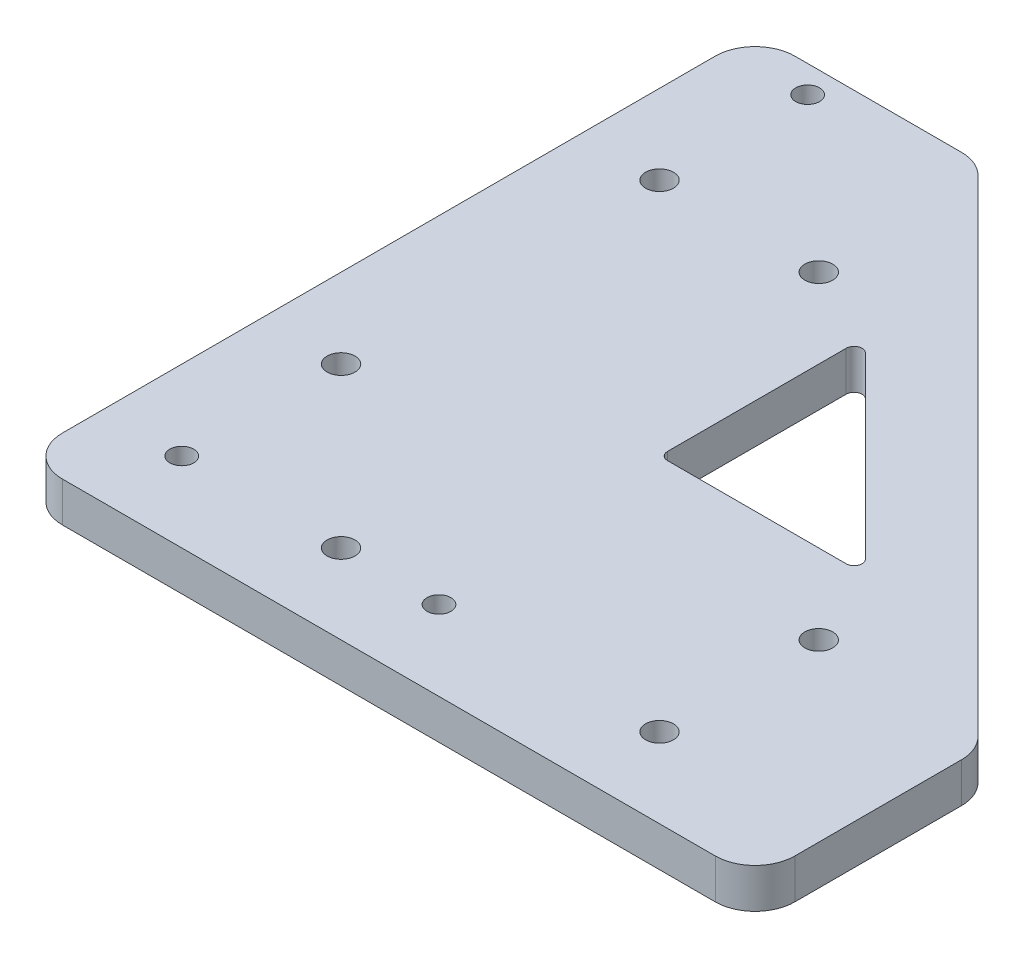
ISO-10303-21;
HEADER;
FILE_DESCRIPTION(('STEP AP214'),'2;1');
FILE_NAME('part.step','',(''),(''),'','','');
FILE_SCHEMA(('AUTOMOTIVE_DESIGN { 1 0 10303 214 1 1 1 1 }'));
ENDSEC;
DATA;
#1=APPLICATION_CONTEXT('core data for automotive mechanical design processes');
#2=APPLICATION_PROTOCOL_DEFINITION('international standard','automotive_design',2000,#1);
#3=PRODUCT_CONTEXT('',#1,'mechanical');
#4=PRODUCT('Part','Part','',(#3));
#5=PRODUCT_RELATED_PRODUCT_CATEGORY('part','',(#4));
#6=PRODUCT_DEFINITION_FORMATION('','',#4);
#7=PRODUCT_DEFINITION_CONTEXT('part definition',#1,'design');
#8=PRODUCT_DEFINITION('design','',#6,#7);
#9=PRODUCT_DEFINITION_SHAPE('','',#8);
#10=(LENGTH_UNIT() NAMED_UNIT(*) SI_UNIT(.MILLI.,.METRE.));
#11=(NAMED_UNIT(*) PLANE_ANGLE_UNIT() SI_UNIT($,.RADIAN.));
#12=(NAMED_UNIT(*) SI_UNIT($,.STERADIAN.) SOLID_ANGLE_UNIT());
#13=UNCERTAINTY_MEASURE_WITH_UNIT(LENGTH_MEASURE(1.E-05),#10,'distance_accuracy_value','');
#14=(GEOMETRIC_REPRESENTATION_CONTEXT(3) GLOBAL_UNCERTAINTY_ASSIGNED_CONTEXT((#13)) GLOBAL_UNIT_ASSIGNED_CONTEXT((#10,
#11,#12)) REPRESENTATION_CONTEXT('',''));
#15=CARTESIAN_POINT('',(0.,0.,0.));
#16=DIRECTION('',(0.,0.,1.));
#17=DIRECTION('',(1.,0.,0.));
#18=AXIS2_PLACEMENT_3D('',#15,#16,#17);
#19=CARTESIAN_POINT('',(0.,5.,0.));
#20=DIRECTION('',(0.,1.,0.));
#21=DIRECTION('',(0.,0.,1.));
#22=AXIS2_PLACEMENT_3D('',#19,#20,#21);
#23=PLANE('',#22);
#24=CARTESIAN_POINT('',(42.3,5.,-10.));
#25=DIRECTION('',(0.,-1.,0.));
#26=DIRECTION('',(0.,0.,-1.));
#27=AXIS2_PLACEMENT_3D('',#24,#25,#26);
#28=CIRCLE('',#27,1.49999999999997);
#29=CARTESIAN_POINT('',(42.3,5.,-11.5));
#30=VERTEX_POINT('',#29);
#31=EDGE_CURVE('E264',#30,#30,#28,.T.);
#32=ORIENTED_EDGE('',*,*,#31,.T.);
#33=EDGE_LOOP('',(#32));
#34=FACE_BOUND('',#33,.T.);
#35=CARTESIAN_POINT('',(10.,5.,-88.6));
#36=DIRECTION('',(0.,-1.,0.));
#37=DIRECTION('',(0.,0.,-1.));
#38=AXIS2_PLACEMENT_3D('',#35,#36,#37);
#39=CIRCLE('',#38,1.49999999999999);
#40=CARTESIAN_POINT('',(10.,5.,-90.1));
#41=VERTEX_POINT('',#40);
#42=EDGE_CURVE('E329',#41,#41,#39,.T.);
#43=ORIENTED_EDGE('',*,*,#42,.T.);
#44=EDGE_LOOP('',(#43));
#45=FACE_BOUND('',#44,.T.);
#46=CARTESIAN_POINT('',(9.99999999999999,5.,-10.));
#47=DIRECTION('',(0.,-1.,0.));
#48=DIRECTION('',(0.,0.,-1.));
#49=AXIS2_PLACEMENT_3D('',#46,#47,#48);
#50=CIRCLE('',#49,1.5);
#51=CARTESIAN_POINT('',(9.99999999999999,5.,-11.5));
#52=VERTEX_POINT('',#51);
#53=EDGE_CURVE('E326',#52,#52,#50,.T.);
#54=ORIENTED_EDGE('',*,*,#53,.T.);
#55=EDGE_LOOP('',(#54));
#56=FACE_BOUND('',#55,.T.);
#57=CARTESIAN_POINT('',(29.9999982118607,5.,-10.));
#58=DIRECTION('',(0.,1.,0.));
#59=DIRECTION('',(0.,0.,1.));
#60=AXIS2_PLACEMENT_3D('',#57,#58,#59);
#61=CIRCLE('',#60,1.75);
#62=CARTESIAN_POINT('',(29.9999982118607,5.,-8.25));
#63=VERTEX_POINT('',#62);
#64=EDGE_CURVE('E213',#63,#63,#61,.T.);
#65=ORIENTED_EDGE('',*,*,#64,.F.);
#66=EDGE_LOOP('',(#65));
#67=FACE_BOUND('',#66,.T.);
#68=CARTESIAN_POINT('',(10.,5.,-29.9999982118607));
#69=DIRECTION('',(0.,1.,0.));
#70=DIRECTION('',(0.,0.,1.));
#71=AXIS2_PLACEMENT_3D('',#68,#69,#70);
#72=CIRCLE('',#71,1.75);
#73=CARTESIAN_POINT('',(10.,5.,-28.2499982118607));
#74=VERTEX_POINT('',#73);
#75=EDGE_CURVE('E225',#74,#74,#72,.T.);
#76=ORIENTED_EDGE('',*,*,#75,.F.);
#77=EDGE_LOOP('',(#76));
#78=FACE_BOUND('',#77,.T.);
#79=CARTESIAN_POINT('',(10.,5.,-69.9999982118607));
#80=DIRECTION('',(0.,1.,0.));
#81=DIRECTION('',(0.,0.,1.));
#82=AXIS2_PLACEMENT_3D('',#79,#80,#81);
#83=CIRCLE('',#82,1.75);
#84=CARTESIAN_POINT('',(10.,5.,-68.2499982118607));
#85=VERTEX_POINT('',#84);
#86=EDGE_CURVE('E237',#85,#85,#83,.T.);
#87=ORIENTED_EDGE('',*,*,#86,.F.);
#88=EDGE_LOOP('',(#87));
#89=FACE_BOUND('',#88,.T.);
#90=DIRECTION('',(-0.707106781186548,0.,-0.707106781186547));
#91=VECTOR('',#90,1.);
#92=CARTESIAN_POINT('',(79.9999982118607,5.,-39.9999991059303));
#93=LINE('',#92,#91);
#94=CARTESIAN_POINT('',(90.5355321177934,5.,-29.4644651999976));
#95=VERTEX_POINT('',#94);
#96=CARTESIAN_POINT('',(29.4644651999976,5.,-90.5355321177934));
#97=VERTEX_POINT('',#96);
#98=EDGE_CURVE('E249',#95,#97,#93,.T.);
#99=ORIENTED_EDGE('',*,*,#98,.T.);
#100=CARTESIAN_POINT('',(25.9289312940648,5.,-86.9999982118606));
#101=DIRECTION('',(0.,1.,0.));
#102=DIRECTION('',(0.,0.,1.));
#103=AXIS2_PLACEMENT_3D('',#100,#101,#102);
#104=CIRCLE('',#103,5.);
#105=CARTESIAN_POINT('',(25.9289312940648,5.,-91.9999982118607));
#106=VERTEX_POINT('',#105);
#107=EDGE_CURVE('E297',#97,#106,#104,.T.);
#108=ORIENTED_EDGE('',*,*,#107,.T.);
#109=DIRECTION('',(1.,0.,0.));
#110=VECTOR('',#109,1.);
#111=CARTESIAN_POINT('',(27.9999991059303,5.,-91.9999982118607));
#112=LINE('',#111,#110);
#113=CARTESIAN_POINT('',(4.99999999999998,5.,-91.9999982118607));
#114=VERTEX_POINT('',#113);
#115=EDGE_CURVE('E320',#114,#106,#112,.T.);
#116=ORIENTED_EDGE('',*,*,#115,.F.);
#117=CARTESIAN_POINT('',(4.99999999999999,5.,-86.9999982118606));
#118=DIRECTION('',(0.,1.,0.));
#119=DIRECTION('',(0.,0.,1.));
#120=AXIS2_PLACEMENT_3D('',#117,#118,#119);
#121=CIRCLE('',#120,5.);
#122=CARTESIAN_POINT('',(0.,5.,-86.9999982118606));
#123=VERTEX_POINT('',#122);
#124=EDGE_CURVE('E295',#114,#123,#121,.T.);
#125=ORIENTED_EDGE('',*,*,#124,.T.);
#126=DIRECTION('',(0.,0.,1.));
#127=VECTOR('',#126,1.);
#128=CARTESIAN_POINT('',(0.,5.,-79.9999982118607));
#129=LINE('',#128,#127);
#130=CARTESIAN_POINT('',(0.,5.,-5.));
#131=VERTEX_POINT('',#130);
#132=EDGE_CURVE('E243',#123,#131,#129,.T.);
#133=ORIENTED_EDGE('',*,*,#132,.T.);
#134=CARTESIAN_POINT('',(5.,5.,-5.));
#135=DIRECTION('',(0.,1.,0.));
#136=DIRECTION('',(0.,0.,1.));
#137=AXIS2_PLACEMENT_3D('',#134,#135,#136);
#138=CIRCLE('',#137,5.);
#139=CARTESIAN_POINT('',(5.,5.,0.));
#140=VERTEX_POINT('',#139);
#141=EDGE_CURVE('E293',#131,#140,#138,.T.);
#142=ORIENTED_EDGE('',*,*,#141,.T.);
#143=DIRECTION('',(1.,0.,0.));
#144=VECTOR('',#143,1.);
#145=CARTESIAN_POINT('',(0.,5.,0.));
#146=LINE('',#145,#144);
#147=CARTESIAN_POINT('',(86.9999982118606,5.,0.));
#148=VERTEX_POINT('',#147);
#149=EDGE_CURVE('E246',#140,#148,#146,.T.);
#150=ORIENTED_EDGE('',*,*,#149,.T.);
#151=CARTESIAN_POINT('',(86.9999982118606,5.,-5.));
#152=DIRECTION('',(0.,1.,0.));
#153=DIRECTION('',(0.,0.,1.));
#154=AXIS2_PLACEMENT_3D('',#151,#152,#153);
#155=CIRCLE('',#154,5.);
#156=CARTESIAN_POINT('',(91.9999982118607,5.,-5.));
#157=VERTEX_POINT('',#156);
#158=EDGE_CURVE('E50',#148,#157,#155,.T.);
#159=ORIENTED_EDGE('',*,*,#158,.T.);
#160=DIRECTION('',(0.,0.,1.));
#161=VECTOR('',#160,1.);
#162=CARTESIAN_POINT('',(91.9999982118607,5.,0.));
#163=LINE('',#162,#161);
#164=CARTESIAN_POINT('',(91.9999982118607,5.,-25.9289312940649));
#165=VERTEX_POINT('',#164);
#166=EDGE_CURVE('E186',#165,#157,#163,.T.);
#167=ORIENTED_EDGE('',*,*,#166,.F.);
#168=CARTESIAN_POINT('',(86.9999982118606,5.,-25.9289312940649));
#169=DIRECTION('',(0.,1.,0.));
#170=DIRECTION('',(0.,0.,1.));
#171=AXIS2_PLACEMENT_3D('',#168,#169,#170);
#172=CIRCLE('',#171,5.);
#173=EDGE_CURVE('E291',#165,#95,#172,.T.);
#174=ORIENTED_EDGE('',*,*,#173,.T.);
#175=EDGE_LOOP('',(#99,#108,#116,#125,#133,#142,#150,#159,#167,#174));
#176=FACE_BOUND('',#175,.T.);
#177=CARTESIAN_POINT('',(30.,5.,-69.9999982118607));
#178=DIRECTION('',(0.,1.,0.));
#179=DIRECTION('',(0.,0.,1.));
#180=AXIS2_PLACEMENT_3D('',#177,#178,#179);
#181=CIRCLE('',#180,1.75);
#182=CARTESIAN_POINT('',(30.,5.,-68.2499982118607));
#183=VERTEX_POINT('',#182);
#184=EDGE_CURVE('E231',#183,#183,#181,.T.);
#185=ORIENTED_EDGE('',*,*,#184,.F.);
#186=EDGE_LOOP('',(#185));
#187=FACE_BOUND('',#186,.T.);
#188=CARTESIAN_POINT('',(69.9999982118607,5.,-30.));
#189=DIRECTION('',(0.,1.,0.));
#190=DIRECTION('',(0.,0.,1.));
#191=AXIS2_PLACEMENT_3D('',#188,#189,#190);
#192=CIRCLE('',#191,1.75);
#193=CARTESIAN_POINT('',(69.9999982118607,5.,-28.25));
#194=VERTEX_POINT('',#193);
#195=EDGE_CURVE('E219',#194,#194,#192,.T.);
#196=ORIENTED_EDGE('',*,*,#195,.F.);
#197=EDGE_LOOP('',(#196));
#198=FACE_BOUND('',#197,.T.);
#199=CARTESIAN_POINT('',(69.9999982118607,5.,-10.));
#200=DIRECTION('',(0.,1.,0.));
#201=DIRECTION('',(0.,0.,1.));
#202=AXIS2_PLACEMENT_3D('',#199,#200,#201);
#203=CIRCLE('',#202,1.75);
#204=CARTESIAN_POINT('',(69.9999982118607,5.,-8.25));
#205=VERTEX_POINT('',#204);
#206=EDGE_CURVE('E207',#205,#205,#203,.T.);
#207=ORIENTED_EDGE('',*,*,#206,.F.);
#208=EDGE_LOOP('',(#207));
#209=FACE_BOUND('',#208,.T.);
#210=DIRECTION('',(-0.707106781186548,0.,-0.707106781186547));
#211=VECTOR('',#210,1.);
#212=CARTESIAN_POINT('',(64.1507549128735,5.,-41.7071067811866));
#213=LINE('',#212,#211);
#214=CARTESIAN_POINT('',(64.1507549128735,5.,-41.7071067811866));
#215=VERTEX_POINT('',#214);
#216=CARTESIAN_POINT('',(41.7071067811865,5.,-64.1507549128735));
#217=VERTEX_POINT('',#216);
#218=EDGE_CURVE('E159',#215,#217,#213,.T.);
#219=ORIENTED_EDGE('',*,*,#218,.F.);
#220=CARTESIAN_POINT('',(63.4436481316869,5.,-41.));
#221=DIRECTION('',(0.,1.,0.));
#222=DIRECTION('',(0.,0.,1.));
#223=AXIS2_PLACEMENT_3D('',#220,#221,#222);
#224=CIRCLE('',#223,1.);
#225=CARTESIAN_POINT('',(63.4436481316869,5.,-40.));
#226=VERTEX_POINT('',#225);
#227=EDGE_CURVE('E149',#226,#215,#224,.T.);
#228=ORIENTED_EDGE('',*,*,#227,.F.);
#229=DIRECTION('',(1.,0.,0.));
#230=VECTOR('',#229,1.);
#231=CARTESIAN_POINT('',(41.,5.,-40.));
#232=LINE('',#231,#230);
#233=CARTESIAN_POINT('',(41.,5.,-40.));
#234=VERTEX_POINT('',#233);
#235=EDGE_CURVE('E182',#234,#226,#232,.T.);
#236=ORIENTED_EDGE('',*,*,#235,.F.);
#237=CARTESIAN_POINT('',(41.,5.,-41.));
#238=DIRECTION('',(0.,1.,0.));
#239=DIRECTION('',(0.,0.,1.));
#240=AXIS2_PLACEMENT_3D('',#237,#238,#239);
#241=CIRCLE('',#240,1.);
#242=CARTESIAN_POINT('',(40.,5.,-41.));
#243=VERTEX_POINT('',#242);
#244=EDGE_CURVE('E179',#243,#234,#241,.T.);
#245=ORIENTED_EDGE('',*,*,#244,.F.);
#246=DIRECTION('',(0.,0.,1.));
#247=VECTOR('',#246,1.);
#248=CARTESIAN_POINT('',(40.,5.,-63.4436481316869));
#249=LINE('',#248,#247);
#250=CARTESIAN_POINT('',(40.,5.,-63.4436481316869));
#251=VERTEX_POINT('',#250);
#252=EDGE_CURVE('E174',#251,#243,#249,.T.);
#253=ORIENTED_EDGE('',*,*,#252,.F.);
#254=CARTESIAN_POINT('',(41.,5.,-63.4436481316869));
#255=DIRECTION('',(0.,1.,0.));
#256=DIRECTION('',(0.,0.,-1.));
#257=AXIS2_PLACEMENT_3D('',#254,#255,#256);
#258=CIRCLE('',#257,0.999999999999998);
#259=EDGE_CURVE('E172',#217,#251,#258,.T.);
#260=ORIENTED_EDGE('',*,*,#259,.F.);
#261=EDGE_LOOP('',(#219,#228,#236,#245,#253,#260));
#262=FACE_BOUND('',#261,.T.);
#263=ADVANCED_FACE('F35',(#34,#45,#56,#67,#78,#89,#176,#187,#198,#209,#262),#23,.T.);
#264=CARTESIAN_POINT('',(0.,0.,0.));
#265=DIRECTION('',(0.,1.,0.));
#266=DIRECTION('',(0.,0.,1.));
#267=AXIS2_PLACEMENT_3D('',#264,#265,#266);
#268=PLANE('',#267);
#269=CARTESIAN_POINT('',(42.3,0.,-10.));
#270=DIRECTION('',(0.,1.,0.));
#271=DIRECTION('',(0.,0.,1.));
#272=AXIS2_PLACEMENT_3D('',#269,#270,#271);
#273=CIRCLE('',#272,1.49999999999997);
#274=CARTESIAN_POINT('',(42.3,0.,-8.50000000000005));
#275=VERTEX_POINT('',#274);
#276=EDGE_CURVE('E267',#275,#275,#273,.T.);
#277=ORIENTED_EDGE('',*,*,#276,.T.);
#278=EDGE_LOOP('',(#277));
#279=FACE_BOUND('',#278,.T.);
#280=CARTESIAN_POINT('',(10.,0.,-88.6));
#281=DIRECTION('',(0.,1.,0.));
#282=DIRECTION('',(0.,0.,1.));
#283=AXIS2_PLACEMENT_3D('',#280,#281,#282);
#284=CIRCLE('',#283,1.49999999999999);
#285=CARTESIAN_POINT('',(10.,0.,-87.1));
#286=VERTEX_POINT('',#285);
#287=EDGE_CURVE('E263',#286,#286,#284,.T.);
#288=ORIENTED_EDGE('',*,*,#287,.T.);
#289=EDGE_LOOP('',(#288));
#290=FACE_BOUND('',#289,.T.);
#291=CARTESIAN_POINT('',(9.99999999999999,0.,-10.));
#292=DIRECTION('',(0.,1.,0.));
#293=DIRECTION('',(0.,0.,1.));
#294=AXIS2_PLACEMENT_3D('',#291,#292,#293);
#295=CIRCLE('',#294,1.5);
#296=CARTESIAN_POINT('',(9.99999999999999,0.,-8.50000000000002));
#297=VERTEX_POINT('',#296);
#298=EDGE_CURVE('E260',#297,#297,#295,.T.);
#299=ORIENTED_EDGE('',*,*,#298,.T.);
#300=EDGE_LOOP('',(#299));
#301=FACE_BOUND('',#300,.T.);
#302=CARTESIAN_POINT('',(69.9999982118607,0.,-10.));
#303=DIRECTION('',(0.,1.,0.));
#304=DIRECTION('',(0.,0.,1.));
#305=AXIS2_PLACEMENT_3D('',#302,#303,#304);
#306=CIRCLE('',#305,1.75);
#307=CARTESIAN_POINT('',(69.9999982118607,0.,-8.25));
#308=VERTEX_POINT('',#307);
#309=EDGE_CURVE('E167',#308,#308,#306,.T.);
#310=ORIENTED_EDGE('',*,*,#309,.T.);
#311=EDGE_LOOP('',(#310));
#312=FACE_BOUND('',#311,.T.);
#313=CARTESIAN_POINT('',(29.9999982118607,0.,-10.));
#314=DIRECTION('',(0.,1.,0.));
#315=DIRECTION('',(0.,0.,1.));
#316=AXIS2_PLACEMENT_3D('',#313,#314,#315);
#317=CIRCLE('',#316,1.75);
#318=CARTESIAN_POINT('',(29.9999982118607,0.,-8.25));
#319=VERTEX_POINT('',#318);
#320=EDGE_CURVE('E210',#319,#319,#317,.T.);
#321=ORIENTED_EDGE('',*,*,#320,.T.);
#322=EDGE_LOOP('',(#321));
#323=FACE_BOUND('',#322,.T.);
#324=CARTESIAN_POINT('',(69.9999982118607,0.,-30.));
#325=DIRECTION('',(0.,1.,0.));
#326=DIRECTION('',(0.,0.,1.));
#327=AXIS2_PLACEMENT_3D('',#324,#325,#326);
#328=CIRCLE('',#327,1.75);
#329=CARTESIAN_POINT('',(69.9999982118607,0.,-28.25));
#330=VERTEX_POINT('',#329);
#331=EDGE_CURVE('E216',#330,#330,#328,.T.);
#332=ORIENTED_EDGE('',*,*,#331,.T.);
#333=EDGE_LOOP('',(#332));
#334=FACE_BOUND('',#333,.T.);
#335=CARTESIAN_POINT('',(10.,0.,-29.9999982118607));
#336=DIRECTION('',(0.,1.,0.));
#337=DIRECTION('',(0.,0.,1.));
#338=AXIS2_PLACEMENT_3D('',#335,#336,#337);
#339=CIRCLE('',#338,1.75);
#340=CARTESIAN_POINT('',(10.,0.,-28.2499982118607));
#341=VERTEX_POINT('',#340);
#342=EDGE_CURVE('E222',#341,#341,#339,.T.);
#343=ORIENTED_EDGE('',*,*,#342,.T.);
#344=EDGE_LOOP('',(#343));
#345=FACE_BOUND('',#344,.T.);
#346=CARTESIAN_POINT('',(30.,0.,-69.9999982118607));
#347=DIRECTION('',(0.,1.,0.));
#348=DIRECTION('',(0.,0.,1.));
#349=AXIS2_PLACEMENT_3D('',#346,#347,#348);
#350=CIRCLE('',#349,1.75);
#351=CARTESIAN_POINT('',(30.,0.,-68.2499982118607));
#352=VERTEX_POINT('',#351);
#353=EDGE_CURVE('E228',#352,#352,#350,.T.);
#354=ORIENTED_EDGE('',*,*,#353,.T.);
#355=EDGE_LOOP('',(#354));
#356=FACE_BOUND('',#355,.T.);
#357=CARTESIAN_POINT('',(10.,0.,-69.9999982118607));
#358=DIRECTION('',(0.,1.,0.));
#359=DIRECTION('',(0.,0.,1.));
#360=AXIS2_PLACEMENT_3D('',#357,#358,#359);
#361=CIRCLE('',#360,1.75);
#362=CARTESIAN_POINT('',(10.,0.,-68.2499982118607));
#363=VERTEX_POINT('',#362);
#364=EDGE_CURVE('E234',#363,#363,#361,.T.);
#365=ORIENTED_EDGE('',*,*,#364,.T.);
#366=EDGE_LOOP('',(#365));
#367=FACE_BOUND('',#366,.T.);
#368=DIRECTION('',(1.,0.,0.));
#369=VECTOR('',#368,1.);
#370=CARTESIAN_POINT('',(27.9999991059303,0.,-91.9999982118607));
#371=LINE('',#370,#369);
#372=CARTESIAN_POINT('',(4.99999999999998,0.,-91.9999982118607));
#373=VERTEX_POINT('',#372);
#374=CARTESIAN_POINT('',(25.9289312940648,0.,-91.9999982118607));
#375=VERTEX_POINT('',#374);
#376=EDGE_CURVE('E270',#373,#375,#371,.T.);
#377=ORIENTED_EDGE('',*,*,#376,.T.);
#378=CARTESIAN_POINT('',(25.9289312940648,0.,-86.9999982118606));
#379=DIRECTION('',(0.,1.,0.));
#380=DIRECTION('',(0.,0.,1.));
#381=AXIS2_PLACEMENT_3D('',#378,#379,#380);
#382=CIRCLE('',#381,5.);
#383=CARTESIAN_POINT('',(29.4644651999976,0.,-90.5355321177934));
#384=VERTEX_POINT('',#383);
#385=EDGE_CURVE('E283',#375,#384,#382,.F.);
#386=ORIENTED_EDGE('',*,*,#385,.T.);
#387=DIRECTION('',(-0.707106781186548,0.,-0.707106781186547));
#388=VECTOR('',#387,1.);
#389=CARTESIAN_POINT('',(79.9999982118607,0.,-39.9999991059303));
#390=LINE('',#389,#388);
#391=CARTESIAN_POINT('',(90.5355321177934,0.,-29.4644651999976));
#392=VERTEX_POINT('',#391);
#393=EDGE_CURVE('E247',#392,#384,#390,.T.);
#394=ORIENTED_EDGE('',*,*,#393,.F.);
#395=CARTESIAN_POINT('',(86.9999982118606,0.,-25.9289312940649));
#396=DIRECTION('',(0.,1.,0.));
#397=DIRECTION('',(0.,0.,1.));
#398=AXIS2_PLACEMENT_3D('',#395,#396,#397);
#399=CIRCLE('',#398,5.);
#400=CARTESIAN_POINT('',(91.9999982118607,0.,-25.9289312940649));
#401=VERTEX_POINT('',#400);
#402=EDGE_CURVE('E277',#392,#401,#399,.F.);
#403=ORIENTED_EDGE('',*,*,#402,.T.);
#404=DIRECTION('',(0.,0.,1.));
#405=VECTOR('',#404,1.);
#406=CARTESIAN_POINT('',(91.9999982118607,0.,0.));
#407=LINE('',#406,#405);
#408=CARTESIAN_POINT('',(91.9999982118607,0.,-5.));
#409=VERTEX_POINT('',#408);
#410=EDGE_CURVE('E312',#401,#409,#407,.T.);
#411=ORIENTED_EDGE('',*,*,#410,.T.);
#412=CARTESIAN_POINT('',(86.9999982118606,0.,-5.));
#413=DIRECTION('',(0.,1.,0.));
#414=DIRECTION('',(0.,0.,1.));
#415=AXIS2_PLACEMENT_3D('',#412,#413,#414);
#416=CIRCLE('',#415,5.);
#417=CARTESIAN_POINT('',(86.9999982118606,0.,0.));
#418=VERTEX_POINT('',#417);
#419=EDGE_CURVE('E275',#409,#418,#416,.F.);
#420=ORIENTED_EDGE('',*,*,#419,.T.);
#421=DIRECTION('',(1.,0.,0.));
#422=VECTOR('',#421,1.);
#423=CARTESIAN_POINT('',(0.,0.,0.));
#424=LINE('',#423,#422);
#425=CARTESIAN_POINT('',(5.,0.,0.));
#426=VERTEX_POINT('',#425);
#427=EDGE_CURVE('E255',#426,#418,#424,.T.);
#428=ORIENTED_EDGE('',*,*,#427,.F.);
#429=CARTESIAN_POINT('',(5.,0.,-5.));
#430=DIRECTION('',(0.,1.,0.));
#431=DIRECTION('',(0.,0.,1.));
#432=AXIS2_PLACEMENT_3D('',#429,#430,#431);
#433=CIRCLE('',#432,5.);
#434=CARTESIAN_POINT('',(0.,0.,-5.));
#435=VERTEX_POINT('',#434);
#436=EDGE_CURVE('E279',#426,#435,#433,.F.);
#437=ORIENTED_EDGE('',*,*,#436,.T.);
#438=DIRECTION('',(0.,0.,1.));
#439=VECTOR('',#438,1.);
#440=CARTESIAN_POINT('',(0.,0.,-79.9999982118607));
#441=LINE('',#440,#439);
#442=CARTESIAN_POINT('',(0.,0.,-86.9999982118606));
#443=VERTEX_POINT('',#442);
#444=EDGE_CURVE('E240',#443,#435,#441,.T.);
#445=ORIENTED_EDGE('',*,*,#444,.F.);
#446=CARTESIAN_POINT('',(4.99999999999999,0.,-86.9999982118606));
#447=DIRECTION('',(0.,1.,0.));
#448=DIRECTION('',(0.,0.,1.));
#449=AXIS2_PLACEMENT_3D('',#446,#447,#448);
#450=CIRCLE('',#449,5.);
#451=EDGE_CURVE('E281',#443,#373,#450,.F.);
#452=ORIENTED_EDGE('',*,*,#451,.T.);
#453=EDGE_LOOP('',(#377,#386,#394,#403,#411,#420,#428,#437,#445,#452));
#454=FACE_BOUND('',#453,.T.);
#455=CARTESIAN_POINT('',(63.4436481316869,0.,-41.));
#456=DIRECTION('',(0.,1.,0.));
#457=DIRECTION('',(0.,0.,1.));
#458=AXIS2_PLACEMENT_3D('',#455,#456,#457);
#459=CIRCLE('',#458,1.);
#460=CARTESIAN_POINT('',(63.4436481316869,0.,-40.));
#461=VERTEX_POINT('',#460);
#462=CARTESIAN_POINT('',(64.1507549128735,0.,-41.7071067811866));
#463=VERTEX_POINT('',#462);
#464=EDGE_CURVE('E184',#461,#463,#459,.T.);
#465=ORIENTED_EDGE('',*,*,#464,.T.);
#466=DIRECTION('',(-0.707106781186548,0.,-0.707106781186547));
#467=VECTOR('',#466,1.);
#468=CARTESIAN_POINT('',(64.1507549128735,0.,-41.7071067811866));
#469=LINE('',#468,#467);
#470=CARTESIAN_POINT('',(41.7071067811865,0.,-64.1507549128735));
#471=VERTEX_POINT('',#470);
#472=EDGE_CURVE('E166',#463,#471,#469,.T.);
#473=ORIENTED_EDGE('',*,*,#472,.T.);
#474=CARTESIAN_POINT('',(41.,0.,-63.4436481316869));
#475=DIRECTION('',(0.,1.,0.));
#476=DIRECTION('',(0.,0.,-1.));
#477=AXIS2_PLACEMENT_3D('',#474,#475,#476);
#478=CIRCLE('',#477,0.999999999999998);
#479=CARTESIAN_POINT('',(40.,0.,-63.4436481316869));
#480=VERTEX_POINT('',#479);
#481=EDGE_CURVE('E188',#471,#480,#478,.T.);
#482=ORIENTED_EDGE('',*,*,#481,.T.);
#483=DIRECTION('',(0.,0.,1.));
#484=VECTOR('',#483,1.);
#485=CARTESIAN_POINT('',(40.,0.,-63.4436481316869));
#486=LINE('',#485,#484);
#487=CARTESIAN_POINT('',(40.,0.,-41.));
#488=VERTEX_POINT('',#487);
#489=EDGE_CURVE('E191',#480,#488,#486,.T.);
#490=ORIENTED_EDGE('',*,*,#489,.T.);
#491=CARTESIAN_POINT('',(41.,0.,-41.));
#492=DIRECTION('',(0.,1.,0.));
#493=DIRECTION('',(0.,0.,1.));
#494=AXIS2_PLACEMENT_3D('',#491,#492,#493);
#495=CIRCLE('',#494,1.);
#496=CARTESIAN_POINT('',(41.,0.,-40.));
#497=VERTEX_POINT('',#496);
#498=EDGE_CURVE('E194',#488,#497,#495,.T.);
#499=ORIENTED_EDGE('',*,*,#498,.T.);
#500=DIRECTION('',(1.,0.,0.));
#501=VECTOR('',#500,1.);
#502=CARTESIAN_POINT('',(41.,0.,-40.));
#503=LINE('',#502,#501);
#504=EDGE_CURVE('E160',#497,#461,#503,.T.);
#505=ORIENTED_EDGE('',*,*,#504,.T.);
#506=EDGE_LOOP('',(#465,#473,#482,#490,#499,#505));
#507=FACE_BOUND('',#506,.T.);
#508=ADVANCED_FACE('F316',(#279,#290,#301,#312,#323,#334,#345,#356,#367,#454,#507),#268,.F.);
#509=CARTESIAN_POINT('',(0.,5.,-79.9999982118607));
#510=DIRECTION('',(1.,0.,0.));
#511=DIRECTION('',(0.,0.,-1.));
#512=AXIS2_PLACEMENT_3D('',#509,#510,#511);
#513=PLANE('',#512);
#514=ORIENTED_EDGE('',*,*,#132,.F.);
#515=DIRECTION('',(0.,-1.,0.));
#516=VECTOR('',#515,1.);
#517=CARTESIAN_POINT('',(0.,0.,-86.9999982118606));
#518=LINE('',#517,#516);
#519=EDGE_CURVE('E301',#123,#443,#518,.T.);
#520=ORIENTED_EDGE('',*,*,#519,.T.);
#521=ORIENTED_EDGE('',*,*,#444,.T.);
#522=DIRECTION('',(0.,-1.,0.));
#523=VECTOR('',#522,1.);
#524=CARTESIAN_POINT('',(0.,5.,-5.));
#525=LINE('',#524,#523);
#526=EDGE_CURVE('E299',#435,#131,#525,.F.);
#527=ORIENTED_EDGE('',*,*,#526,.T.);
#528=EDGE_LOOP('',(#514,#520,#521,#527));
#529=FACE_BOUND('',#528,.T.);
#530=ADVANCED_FACE('F347',(#529),#513,.F.);
#531=CARTESIAN_POINT('',(0.,5.,0.));
#532=DIRECTION('',(0.,0.,-1.));
#533=DIRECTION('',(-1.,0.,0.));
#534=AXIS2_PLACEMENT_3D('',#531,#532,#533);
#535=PLANE('',#534);
#536=ORIENTED_EDGE('',*,*,#149,.F.);
#537=DIRECTION('',(0.,-1.,0.));
#538=VECTOR('',#537,1.);
#539=CARTESIAN_POINT('',(5.,5.,0.));
#540=LINE('',#539,#538);
#541=EDGE_CURVE('E306',#140,#426,#540,.T.);
#542=ORIENTED_EDGE('',*,*,#541,.T.);
#543=ORIENTED_EDGE('',*,*,#427,.T.);
#544=DIRECTION('',(0.,-1.,0.));
#545=VECTOR('',#544,1.);
#546=CARTESIAN_POINT('',(86.9999982118606,5.,0.));
#547=LINE('',#546,#545);
#548=EDGE_CURVE('E304',#418,#148,#547,.F.);
#549=ORIENTED_EDGE('',*,*,#548,.T.);
#550=EDGE_LOOP('',(#536,#542,#543,#549));
#551=FACE_BOUND('',#550,.T.);
#552=ADVANCED_FACE('F379',(#551),#535,.F.);
#553=CARTESIAN_POINT('',(79.9999982118607,5.,-39.9999991059303));
#554=DIRECTION('',(-0.707106781186547,0.,0.707106781186548));
#555=DIRECTION('',(0.707106781186548,0.,0.707106781186547));
#556=AXIS2_PLACEMENT_3D('',#553,#554,#555);
#557=PLANE('',#556);
#558=ORIENTED_EDGE('',*,*,#393,.T.);
#559=DIRECTION('',(0.,-1.,0.));
#560=VECTOR('',#559,1.);
#561=CARTESIAN_POINT('',(29.4644651999976,5.,-90.5355321177934));
#562=LINE('',#561,#560);
#563=EDGE_CURVE('E288',#384,#97,#562,.F.);
#564=ORIENTED_EDGE('',*,*,#563,.T.);
#565=ORIENTED_EDGE('',*,*,#98,.F.);
#566=DIRECTION('',(0.,-1.,0.));
#567=VECTOR('',#566,1.);
#568=CARTESIAN_POINT('',(90.5355321177934,0.,-29.4644651999976));
#569=LINE('',#568,#567);
#570=EDGE_CURVE('E285',#95,#392,#569,.T.);
#571=ORIENTED_EDGE('',*,*,#570,.T.);
#572=EDGE_LOOP('',(#558,#564,#565,#571));
#573=FACE_BOUND('',#572,.T.);
#574=ADVANCED_FACE('F368',(#573),#557,.F.);
#575=CARTESIAN_POINT('',(10.,5.,-69.9999982118607));
#576=DIRECTION('',(0.,-1.,0.));
#577=DIRECTION('',(0.,0.,-1.));
#578=AXIS2_PLACEMENT_3D('',#575,#576,#577);
#579=CYLINDRICAL_SURFACE('',#578,1.75);
#580=ORIENTED_EDGE('',*,*,#86,.T.);
#581=EDGE_LOOP('',(#580));
#582=FACE_BOUND('',#581,.T.);
#583=ORIENTED_EDGE('',*,*,#364,.F.);
#584=EDGE_LOOP('',(#583));
#585=FACE_BOUND('',#584,.T.);
#586=ADVANCED_FACE('F365',(#582,#585),#579,.F.);
#587=CARTESIAN_POINT('',(30.,5.,-69.9999982118607));
#588=DIRECTION('',(0.,-1.,0.));
#589=DIRECTION('',(0.,0.,-1.));
#590=AXIS2_PLACEMENT_3D('',#587,#588,#589);
#591=CYLINDRICAL_SURFACE('',#590,1.75);
#592=ORIENTED_EDGE('',*,*,#184,.T.);
#593=EDGE_LOOP('',(#592));
#594=FACE_BOUND('',#593,.T.);
#595=ORIENTED_EDGE('',*,*,#353,.F.);
#596=EDGE_LOOP('',(#595));
#597=FACE_BOUND('',#596,.T.);
#598=ADVANCED_FACE('F367',(#594,#597),#591,.F.);
#599=CARTESIAN_POINT('',(10.,5.,-29.9999982118607));
#600=DIRECTION('',(0.,-1.,0.));
#601=DIRECTION('',(0.,0.,-1.));
#602=AXIS2_PLACEMENT_3D('',#599,#600,#601);
#603=CYLINDRICAL_SURFACE('',#602,1.75);
#604=ORIENTED_EDGE('',*,*,#75,.T.);
#605=EDGE_LOOP('',(#604));
#606=FACE_BOUND('',#605,.T.);
#607=ORIENTED_EDGE('',*,*,#342,.F.);
#608=EDGE_LOOP('',(#607));
#609=FACE_BOUND('',#608,.T.);
#610=ADVANCED_FACE('F375',(#606,#609),#603,.F.);
#611=CARTESIAN_POINT('',(69.9999982118607,5.,-30.));
#612=DIRECTION('',(0.,-1.,0.));
#613=DIRECTION('',(0.,0.,-1.));
#614=AXIS2_PLACEMENT_3D('',#611,#612,#613);
#615=CYLINDRICAL_SURFACE('',#614,1.75);
#616=ORIENTED_EDGE('',*,*,#195,.T.);
#617=EDGE_LOOP('',(#616));
#618=FACE_BOUND('',#617,.T.);
#619=ORIENTED_EDGE('',*,*,#331,.F.);
#620=EDGE_LOOP('',(#619));
#621=FACE_BOUND('',#620,.T.);
#622=ADVANCED_FACE('F471',(#618,#621),#615,.F.);
#623=CARTESIAN_POINT('',(29.9999982118607,5.,-10.));
#624=DIRECTION('',(0.,-1.,0.));
#625=DIRECTION('',(0.,0.,-1.));
#626=AXIS2_PLACEMENT_3D('',#623,#624,#625);
#627=CYLINDRICAL_SURFACE('',#626,1.75);
#628=ORIENTED_EDGE('',*,*,#64,.T.);
#629=EDGE_LOOP('',(#628));
#630=FACE_BOUND('',#629,.T.);
#631=ORIENTED_EDGE('',*,*,#320,.F.);
#632=EDGE_LOOP('',(#631));
#633=FACE_BOUND('',#632,.T.);
#634=ADVANCED_FACE('F467',(#630,#633),#627,.F.);
#635=CARTESIAN_POINT('',(69.9999982118607,5.,-10.));
#636=DIRECTION('',(0.,-1.,0.));
#637=DIRECTION('',(0.,0.,-1.));
#638=AXIS2_PLACEMENT_3D('',#635,#636,#637);
#639=CYLINDRICAL_SURFACE('',#638,1.75);
#640=ORIENTED_EDGE('',*,*,#206,.T.);
#641=EDGE_LOOP('',(#640));
#642=FACE_BOUND('',#641,.T.);
#643=ORIENTED_EDGE('',*,*,#309,.F.);
#644=EDGE_LOOP('',(#643));
#645=FACE_BOUND('',#644,.T.);
#646=ADVANCED_FACE('F464',(#642,#645),#639,.F.);
#647=CARTESIAN_POINT('',(63.4436481316869,5.,-41.));
#648=DIRECTION('',(0.,-1.,0.));
#649=DIRECTION('',(0.,0.,-1.));
#650=AXIS2_PLACEMENT_3D('',#647,#648,#649);
#651=CYLINDRICAL_SURFACE('',#650,1.);
#652=ORIENTED_EDGE('',*,*,#464,.F.);
#653=DIRECTION('',(0.,-1.,0.));
#654=VECTOR('',#653,1.);
#655=CARTESIAN_POINT('',(63.4436481316869,5.,-40.));
#656=LINE('',#655,#654);
#657=EDGE_CURVE('E155',#226,#461,#656,.T.);
#658=ORIENTED_EDGE('',*,*,#657,.F.);
#659=ORIENTED_EDGE('',*,*,#227,.T.);
#660=DIRECTION('',(0.,-1.,0.));
#661=VECTOR('',#660,1.);
#662=CARTESIAN_POINT('',(64.1507549128735,5.,-41.7071067811866));
#663=LINE('',#662,#661);
#664=EDGE_CURVE('E152',#215,#463,#663,.T.);
#665=ORIENTED_EDGE('',*,*,#664,.T.);
#666=EDGE_LOOP('',(#652,#658,#659,#665));
#667=FACE_BOUND('',#666,.T.);
#668=ADVANCED_FACE('F151',(#667),#651,.F.);
#669=CARTESIAN_POINT('',(64.1507549128735,5.,-41.7071067811866));
#670=DIRECTION('',(-0.707106781186547,0.,0.707106781186548));
#671=DIRECTION('',(0.707106781186548,0.,0.707106781186547));
#672=AXIS2_PLACEMENT_3D('',#669,#670,#671);
#673=PLANE('',#672);
#674=ORIENTED_EDGE('',*,*,#472,.F.);
#675=ORIENTED_EDGE('',*,*,#664,.F.);
#676=ORIENTED_EDGE('',*,*,#218,.T.);
#677=DIRECTION('',(0.,-1.,0.));
#678=VECTOR('',#677,1.);
#679=CARTESIAN_POINT('',(41.7071067811865,5.,-64.1507549128735));
#680=LINE('',#679,#678);
#681=EDGE_CURVE('E168',#217,#471,#680,.T.);
#682=ORIENTED_EDGE('',*,*,#681,.T.);
#683=EDGE_LOOP('',(#674,#675,#676,#682));
#684=FACE_BOUND('',#683,.T.);
#685=ADVANCED_FACE('F163',(#684),#673,.T.);
#686=CARTESIAN_POINT('',(41.,5.,-63.4436481316869));
#687=DIRECTION('',(0.,-1.,0.));
#688=DIRECTION('',(0.,0.,-1.));
#689=AXIS2_PLACEMENT_3D('',#686,#687,#688);
#690=CYLINDRICAL_SURFACE('',#689,0.999999999999998);
#691=ORIENTED_EDGE('',*,*,#481,.F.);
#692=ORIENTED_EDGE('',*,*,#681,.F.);
#693=ORIENTED_EDGE('',*,*,#259,.T.);
#694=DIRECTION('',(0.,-1.,0.));
#695=VECTOR('',#694,1.);
#696=CARTESIAN_POINT('',(40.,5.,-63.4436481316869));
#697=LINE('',#696,#695);
#698=EDGE_CURVE('E204',#251,#480,#697,.T.);
#699=ORIENTED_EDGE('',*,*,#698,.T.);
#700=EDGE_LOOP('',(#691,#692,#693,#699));
#701=FACE_BOUND('',#700,.T.);
#702=ADVANCED_FACE('F455',(#701),#690,.F.);
#703=CARTESIAN_POINT('',(40.,5.,-63.4436481316869));
#704=DIRECTION('',(1.,0.,0.));
#705=DIRECTION('',(0.,0.,-1.));
#706=AXIS2_PLACEMENT_3D('',#703,#704,#705);
#707=PLANE('',#706);
#708=ORIENTED_EDGE('',*,*,#489,.F.);
#709=ORIENTED_EDGE('',*,*,#698,.F.);
#710=ORIENTED_EDGE('',*,*,#252,.T.);
#711=DIRECTION('',(0.,-1.,0.));
#712=VECTOR('',#711,1.);
#713=CARTESIAN_POINT('',(40.,5.,-41.));
#714=LINE('',#713,#712);
#715=EDGE_CURVE('E202',#243,#488,#714,.T.);
#716=ORIENTED_EDGE('',*,*,#715,.T.);
#717=EDGE_LOOP('',(#708,#709,#710,#716));
#718=FACE_BOUND('',#717,.T.);
#719=ADVANCED_FACE('F451',(#718),#707,.T.);
#720=CARTESIAN_POINT('',(41.,5.,-41.));
#721=DIRECTION('',(0.,-1.,0.));
#722=DIRECTION('',(0.,0.,-1.));
#723=AXIS2_PLACEMENT_3D('',#720,#721,#722);
#724=CYLINDRICAL_SURFACE('',#723,1.);
#725=ORIENTED_EDGE('',*,*,#498,.F.);
#726=ORIENTED_EDGE('',*,*,#715,.F.);
#727=ORIENTED_EDGE('',*,*,#244,.T.);
#728=DIRECTION('',(0.,-1.,0.));
#729=VECTOR('',#728,1.);
#730=CARTESIAN_POINT('',(41.,5.,-40.));
#731=LINE('',#730,#729);
#732=EDGE_CURVE('E200',#234,#497,#731,.T.);
#733=ORIENTED_EDGE('',*,*,#732,.T.);
#734=EDGE_LOOP('',(#725,#726,#727,#733));
#735=FACE_BOUND('',#734,.T.);
#736=ADVANCED_FACE('F447',(#735),#724,.F.);
#737=CARTESIAN_POINT('',(41.,5.,-40.));
#738=DIRECTION('',(0.,0.,-1.));
#739=DIRECTION('',(-1.,0.,0.));
#740=AXIS2_PLACEMENT_3D('',#737,#738,#739);
#741=PLANE('',#740);
#742=ORIENTED_EDGE('',*,*,#504,.F.);
#743=ORIENTED_EDGE('',*,*,#732,.F.);
#744=ORIENTED_EDGE('',*,*,#235,.T.);
#745=ORIENTED_EDGE('',*,*,#657,.T.);
#746=EDGE_LOOP('',(#742,#743,#744,#745));
#747=FACE_BOUND('',#746,.T.);
#748=ADVANCED_FACE('F441',(#747),#741,.T.);
#749=CARTESIAN_POINT('',(91.9999982118607,46.7612251792788,0.));
#750=DIRECTION('',(1.,0.,0.));
#751=DIRECTION('',(0.,0.,-1.));
#752=AXIS2_PLACEMENT_3D('',#749,#750,#751);
#753=PLANE('',#752);
#754=ORIENTED_EDGE('',*,*,#410,.F.);
#755=DIRECTION('',(0.,-1.,0.));
#756=VECTOR('',#755,1.);
#757=CARTESIAN_POINT('',(91.9999982118607,5.,-25.9289312940649));
#758=LINE('',#757,#756);
#759=EDGE_CURVE('E11',#401,#165,#758,.F.);
#760=ORIENTED_EDGE('',*,*,#759,.T.);
#761=ORIENTED_EDGE('',*,*,#166,.T.);
#762=DIRECTION('',(0.,-1.,0.));
#763=VECTOR('',#762,1.);
#764=CARTESIAN_POINT('',(91.9999982118607,0.,-5.));
#765=LINE('',#764,#763);
#766=EDGE_CURVE('E43',#157,#409,#765,.T.);
#767=ORIENTED_EDGE('',*,*,#766,.T.);
#768=EDGE_LOOP('',(#754,#760,#761,#767));
#769=FACE_BOUND('',#768,.T.);
#770=ADVANCED_FACE('F311',(#769),#753,.T.);
#771=CARTESIAN_POINT('',(27.9999991059303,46.7612251792788,-91.9999982118607));
#772=DIRECTION('',(0.,0.,-1.));
#773=DIRECTION('',(-1.,0.,0.));
#774=AXIS2_PLACEMENT_3D('',#771,#772,#773);
#775=PLANE('',#774);
#776=ORIENTED_EDGE('',*,*,#115,.T.);
#777=DIRECTION('',(0.,-1.,0.));
#778=VECTOR('',#777,1.);
#779=CARTESIAN_POINT('',(25.9289312940648,0.,-91.9999982118607));
#780=LINE('',#779,#778);
#781=EDGE_CURVE('E272',#106,#375,#780,.T.);
#782=ORIENTED_EDGE('',*,*,#781,.T.);
#783=ORIENTED_EDGE('',*,*,#376,.F.);
#784=DIRECTION('',(0.,-1.,0.));
#785=VECTOR('',#784,1.);
#786=CARTESIAN_POINT('',(4.99999999999999,5.,-91.9999982118607));
#787=LINE('',#786,#785);
#788=EDGE_CURVE('E252',#373,#114,#787,.F.);
#789=ORIENTED_EDGE('',*,*,#788,.T.);
#790=EDGE_LOOP('',(#776,#782,#783,#789));
#791=FACE_BOUND('',#790,.T.);
#792=ADVANCED_FACE('F420',(#791),#775,.T.);
#793=CARTESIAN_POINT('',(9.99999999999999,5.,-10.));
#794=DIRECTION('',(0.,-1.,0.));
#795=DIRECTION('',(0.,0.,-1.));
#796=AXIS2_PLACEMENT_3D('',#793,#794,#795);
#797=CYLINDRICAL_SURFACE('',#796,1.5);
#798=ORIENTED_EDGE('',*,*,#53,.F.);
#799=EDGE_LOOP('',(#798));
#800=FACE_BOUND('',#799,.T.);
#801=ORIENTED_EDGE('',*,*,#298,.F.);
#802=EDGE_LOOP('',(#801));
#803=FACE_BOUND('',#802,.T.);
#804=ADVANCED_FACE('F432',(#800,#803),#797,.F.);
#805=CARTESIAN_POINT('',(10.,5.,-88.6));
#806=DIRECTION('',(0.,-1.,0.));
#807=DIRECTION('',(0.,0.,-1.));
#808=AXIS2_PLACEMENT_3D('',#805,#806,#807);
#809=CYLINDRICAL_SURFACE('',#808,1.49999999999999);
#810=ORIENTED_EDGE('',*,*,#42,.F.);
#811=EDGE_LOOP('',(#810));
#812=FACE_BOUND('',#811,.T.);
#813=ORIENTED_EDGE('',*,*,#287,.F.);
#814=EDGE_LOOP('',(#813));
#815=FACE_BOUND('',#814,.T.);
#816=ADVANCED_FACE('F341',(#812,#815),#809,.F.);
#817=CARTESIAN_POINT('',(42.3,5.,-10.));
#818=DIRECTION('',(0.,-1.,0.));
#819=DIRECTION('',(0.,0.,-1.));
#820=AXIS2_PLACEMENT_3D('',#817,#818,#819);
#821=CYLINDRICAL_SURFACE('',#820,1.49999999999997);
#822=ORIENTED_EDGE('',*,*,#31,.F.);
#823=EDGE_LOOP('',(#822));
#824=FACE_BOUND('',#823,.T.);
#825=ORIENTED_EDGE('',*,*,#276,.F.);
#826=EDGE_LOOP('',(#825));
#827=FACE_BOUND('',#826,.T.);
#828=ADVANCED_FACE('F337',(#824,#827),#821,.F.);
#829=CARTESIAN_POINT('',(25.9289312940648,46.7612251792788,-86.9999982118606));
#830=DIRECTION('',(0.,1.,0.));
#831=DIRECTION('',(0.,0.,1.));
#832=AXIS2_PLACEMENT_3D('',#829,#830,#831);
#833=CYLINDRICAL_SURFACE('',#832,5.);
#834=ORIENTED_EDGE('',*,*,#107,.F.);
#835=ORIENTED_EDGE('',*,*,#563,.F.);
#836=ORIENTED_EDGE('',*,*,#385,.F.);
#837=ORIENTED_EDGE('',*,*,#781,.F.);
#838=EDGE_LOOP('',(#834,#835,#836,#837));
#839=FACE_BOUND('',#838,.T.);
#840=ADVANCED_FACE('F340',(#839),#833,.T.);
#841=CARTESIAN_POINT('',(4.99999999999999,5.,-86.9999982118606));
#842=DIRECTION('',(0.,1.,0.));
#843=DIRECTION('',(0.,0.,1.));
#844=AXIS2_PLACEMENT_3D('',#841,#842,#843);
#845=CYLINDRICAL_SURFACE('',#844,5.);
#846=ORIENTED_EDGE('',*,*,#124,.F.);
#847=ORIENTED_EDGE('',*,*,#788,.F.);
#848=ORIENTED_EDGE('',*,*,#451,.F.);
#849=ORIENTED_EDGE('',*,*,#519,.F.);
#850=EDGE_LOOP('',(#846,#847,#848,#849));
#851=FACE_BOUND('',#850,.T.);
#852=ADVANCED_FACE('F396',(#851),#845,.T.);
#853=CARTESIAN_POINT('',(5.,5.,-5.));
#854=DIRECTION('',(0.,-1.,0.));
#855=DIRECTION('',(0.,0.,-1.));
#856=AXIS2_PLACEMENT_3D('',#853,#854,#855);
#857=CYLINDRICAL_SURFACE('',#856,5.);
#858=ORIENTED_EDGE('',*,*,#141,.F.);
#859=ORIENTED_EDGE('',*,*,#526,.F.);
#860=ORIENTED_EDGE('',*,*,#436,.F.);
#861=ORIENTED_EDGE('',*,*,#541,.F.);
#862=EDGE_LOOP('',(#858,#859,#860,#861));
#863=FACE_BOUND('',#862,.T.);
#864=ADVANCED_FACE('F400',(#863),#857,.T.);
#865=CARTESIAN_POINT('',(86.9999982118606,5.,-25.9289312940649));
#866=DIRECTION('',(0.,1.,0.));
#867=DIRECTION('',(0.,0.,1.));
#868=AXIS2_PLACEMENT_3D('',#865,#866,#867);
#869=CYLINDRICAL_SURFACE('',#868,5.);
#870=ORIENTED_EDGE('',*,*,#173,.F.);
#871=ORIENTED_EDGE('',*,*,#759,.F.);
#872=ORIENTED_EDGE('',*,*,#402,.F.);
#873=ORIENTED_EDGE('',*,*,#570,.F.);
#874=EDGE_LOOP('',(#870,#871,#872,#873));
#875=FACE_BOUND('',#874,.T.);
#876=ADVANCED_FACE('F403',(#875),#869,.T.);
#877=CARTESIAN_POINT('',(86.9999982118606,46.7612251792788,-5.));
#878=DIRECTION('',(0.,1.,0.));
#879=DIRECTION('',(0.,0.,1.));
#880=AXIS2_PLACEMENT_3D('',#877,#878,#879);
#881=CYLINDRICAL_SURFACE('',#880,5.);
#882=ORIENTED_EDGE('',*,*,#158,.F.);
#883=ORIENTED_EDGE('',*,*,#548,.F.);
#884=ORIENTED_EDGE('',*,*,#419,.F.);
#885=ORIENTED_EDGE('',*,*,#766,.F.);
#886=EDGE_LOOP('',(#882,#883,#884,#885));
#887=FACE_BOUND('',#886,.T.);
#888=ADVANCED_FACE('F37',(#887),#881,.T.);
#889=CLOSED_SHELL('',(#263,#508,#530,#552,#574,#586,#598,#610,#622,#634,#646,#668,#685,#702,
#719,#736,#748,#770,#792,#804,#816,#828,#840,#852,#864,#876,#888));
#890=MANIFOLD_SOLID_BREP('B2',#889);
#891=ADVANCED_BREP_SHAPE_REPRESENTATION('',(#18,#890),#14);
#892=SHAPE_DEFINITION_REPRESENTATION(#9,#891);
ENDSEC;
END-ISO-10303-21;
